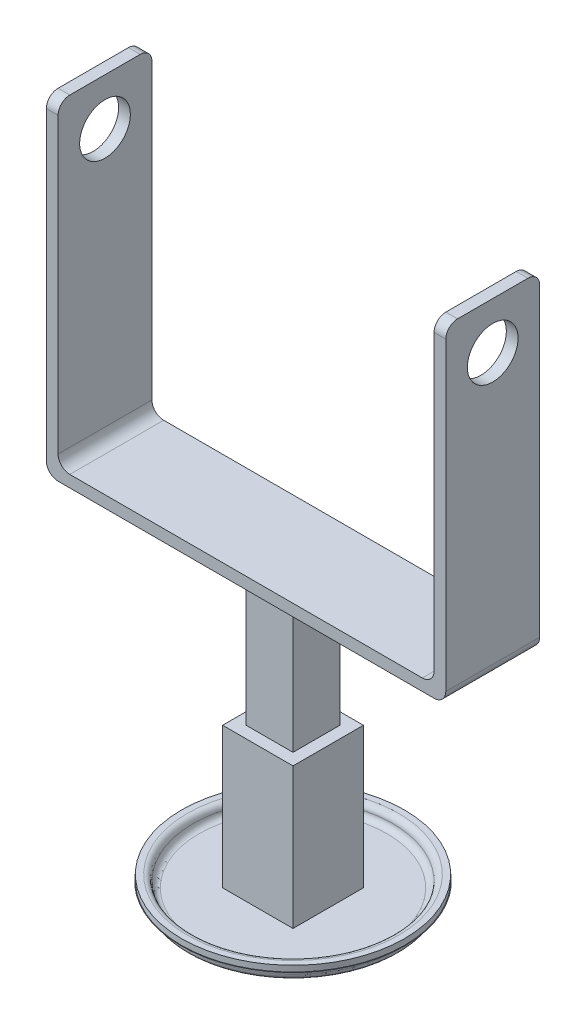
ISO-10303-21;
HEADER;
FILE_DESCRIPTION(('STEP AP214'),'2;1');
FILE_NAME('part.step','',(''),(''),'','','');
FILE_SCHEMA(('AUTOMOTIVE_DESIGN { 1 0 10303 214 1 1 1 1 }'));
ENDSEC;
DATA;
#1=APPLICATION_CONTEXT('core data for automotive mechanical design processes');
#2=APPLICATION_PROTOCOL_DEFINITION('international standard','automotive_design',2000,#1);
#3=PRODUCT_CONTEXT('',#1,'mechanical');
#4=PRODUCT('Part','Part','',(#3));
#5=PRODUCT_RELATED_PRODUCT_CATEGORY('part','',(#4));
#6=PRODUCT_DEFINITION_FORMATION('','',#4);
#7=PRODUCT_DEFINITION_CONTEXT('part definition',#1,'design');
#8=PRODUCT_DEFINITION('design','',#6,#7);
#9=PRODUCT_DEFINITION_SHAPE('','',#8);
#10=(LENGTH_UNIT() NAMED_UNIT(*) SI_UNIT(.MILLI.,.METRE.));
#11=(NAMED_UNIT(*) PLANE_ANGLE_UNIT() SI_UNIT($,.RADIAN.));
#12=(NAMED_UNIT(*) SI_UNIT($,.STERADIAN.) SOLID_ANGLE_UNIT());
#13=UNCERTAINTY_MEASURE_WITH_UNIT(LENGTH_MEASURE(1.E-05),#10,'distance_accuracy_value','');
#14=(GEOMETRIC_REPRESENTATION_CONTEXT(3) GLOBAL_UNCERTAINTY_ASSIGNED_CONTEXT((#13)) GLOBAL_UNIT_ASSIGNED_CONTEXT((#10,
#11,#12)) REPRESENTATION_CONTEXT('',''));
#15=CARTESIAN_POINT('',(0.,0.,0.));
#16=DIRECTION('',(0.,0.,1.));
#17=DIRECTION('',(1.,0.,0.));
#18=AXIS2_PLACEMENT_3D('',#15,#16,#17);
#19=CARTESIAN_POINT('',(0.,79.375,0.));
#20=DIRECTION('',(0.,-1.,0.));
#21=DIRECTION('',(1.,0.,0.));
#22=AXIS2_PLACEMENT_3D('',#19,#20,#21);
#23=PLANE('',#22);
#24=DIRECTION('',(0.,0.,1.));
#25=VECTOR('',#24,1.);
#26=CARTESIAN_POINT('',(-19.0499999999999,79.3750000000001,-19.05));
#27=LINE('',#26,#25);
#28=CARTESIAN_POINT('',(-19.0499999999999,79.3750000000001,-19.05));
#29=VERTEX_POINT('',#28);
#30=CARTESIAN_POINT('',(-19.0499999999999,79.3750000000001,19.05));
#31=VERTEX_POINT('',#30);
#32=EDGE_CURVE('E241',#29,#31,#27,.T.);
#33=ORIENTED_EDGE('',*,*,#32,.T.);
#34=DIRECTION('',(1.,0.,0.));
#35=VECTOR('',#34,1.);
#36=CARTESIAN_POINT('',(19.0500000000001,79.375,19.05));
#37=LINE('',#36,#35);
#38=CARTESIAN_POINT('',(19.0500000000001,79.375,19.05));
#39=VERTEX_POINT('',#38);
#40=EDGE_CURVE('E244',#31,#39,#37,.T.);
#41=ORIENTED_EDGE('',*,*,#40,.T.);
#42=DIRECTION('',(0.,0.,-1.));
#43=VECTOR('',#42,1.);
#44=CARTESIAN_POINT('',(19.0500000000001,79.375,-19.05));
#45=LINE('',#44,#43);
#46=CARTESIAN_POINT('',(19.0500000000001,79.375,-19.05));
#47=VERTEX_POINT('',#46);
#48=EDGE_CURVE('E247',#39,#47,#45,.T.);
#49=ORIENTED_EDGE('',*,*,#48,.T.);
#50=DIRECTION('',(-1.,0.,0.));
#51=VECTOR('',#50,1.);
#52=CARTESIAN_POINT('',(19.0500000000001,79.375,-19.05));
#53=LINE('',#52,#51);
#54=EDGE_CURVE('E249',#47,#29,#53,.T.);
#55=ORIENTED_EDGE('',*,*,#54,.T.);
#56=EDGE_LOOP('',(#33,#41,#49,#55));
#57=FACE_BOUND('',#56,.T.);
#58=DIRECTION('',(0.,0.,1.));
#59=VECTOR('',#58,1.);
#60=CARTESIAN_POINT('',(-12.6999999999999,79.375,-12.7));
#61=LINE('',#60,#59);
#62=CARTESIAN_POINT('',(-12.6999999999999,79.375,-12.7));
#63=VERTEX_POINT('',#62);
#64=CARTESIAN_POINT('',(-12.6999999999999,79.375,12.7));
#65=VERTEX_POINT('',#64);
#66=EDGE_CURVE('E225',#63,#65,#61,.T.);
#67=ORIENTED_EDGE('',*,*,#66,.F.);
#68=DIRECTION('',(-1.,0.,0.));
#69=VECTOR('',#68,1.);
#70=CARTESIAN_POINT('',(12.7000000000001,79.375,-12.7));
#71=LINE('',#70,#69);
#72=CARTESIAN_POINT('',(12.7000000000001,79.375,-12.7));
#73=VERTEX_POINT('',#72);
#74=EDGE_CURVE('E207',#73,#63,#71,.T.);
#75=ORIENTED_EDGE('',*,*,#74,.F.);
#76=DIRECTION('',(0.,0.,-1.));
#77=VECTOR('',#76,1.);
#78=CARTESIAN_POINT('',(12.7000000000001,79.375,-12.7));
#79=LINE('',#78,#77);
#80=CARTESIAN_POINT('',(12.7000000000001,79.375,12.7));
#81=VERTEX_POINT('',#80);
#82=EDGE_CURVE('E231',#81,#73,#79,.T.);
#83=ORIENTED_EDGE('',*,*,#82,.F.);
#84=DIRECTION('',(1.,0.,0.));
#85=VECTOR('',#84,1.);
#86=CARTESIAN_POINT('',(12.7000000000001,79.375,12.7));
#87=LINE('',#86,#85);
#88=EDGE_CURVE('E227',#65,#81,#87,.T.);
#89=ORIENTED_EDGE('',*,*,#88,.F.);
#90=EDGE_LOOP('',(#67,#75,#83,#89));
#91=FACE_BOUND('',#90,.T.);
#92=ADVANCED_FACE('F33',(#57,#91),#23,.F.);
#93=CARTESIAN_POINT('',(50.8,3.17499999999998,0.));
#94=DIRECTION('',(0.,-1.,0.));
#95=DIRECTION('',(1.,0.,0.));
#96=AXIS2_PLACEMENT_3D('',#93,#94,#95);
#97=PLANE('',#96);
#98=CARTESIAN_POINT('',(0.,3.17500000000006,0.));
#99=DIRECTION('',(0.,1.,0.));
#100=DIRECTION('',(-1.,0.,0.));
#101=AXIS2_PLACEMENT_3D('',#98,#99,#100);
#102=CIRCLE('',#101,50.8);
#103=CARTESIAN_POINT('',(-50.8,3.17500000000012,0.));
#104=VERTEX_POINT('',#103);
#105=EDGE_CURVE('E273',#104,#104,#102,.T.);
#106=ORIENTED_EDGE('',*,*,#105,.T.);
#107=EDGE_LOOP('',(#106));
#108=FACE_BOUND('',#107,.T.);
#109=DIRECTION('',(0.,0.,1.));
#110=VECTOR('',#109,1.);
#111=CARTESIAN_POINT('',(-19.05,3.17500000000005,-19.05));
#112=LINE('',#111,#110);
#113=CARTESIAN_POINT('',(-19.05,3.17500000000005,-19.05));
#114=VERTEX_POINT('',#113);
#115=CARTESIAN_POINT('',(-19.05,3.17500000000005,19.05));
#116=VERTEX_POINT('',#115);
#117=EDGE_CURVE('E240',#114,#116,#112,.T.);
#118=ORIENTED_EDGE('',*,*,#117,.F.);
#119=DIRECTION('',(-1.,0.,0.));
#120=VECTOR('',#119,1.);
#121=CARTESIAN_POINT('',(19.05,3.17500000000001,-19.05));
#122=LINE('',#121,#120);
#123=CARTESIAN_POINT('',(19.0500000000001,3.17500000000001,-19.05));
#124=VERTEX_POINT('',#123);
#125=EDGE_CURVE('E245',#124,#114,#122,.T.);
#126=ORIENTED_EDGE('',*,*,#125,.F.);
#127=DIRECTION('',(0.,0.,-1.));
#128=VECTOR('',#127,1.);
#129=CARTESIAN_POINT('',(19.05,3.17500000000001,-19.05));
#130=LINE('',#129,#128);
#131=CARTESIAN_POINT('',(19.05,3.17500000000001,19.05));
#132=VERTEX_POINT('',#131);
#133=EDGE_CURVE('E257',#132,#124,#130,.T.);
#134=ORIENTED_EDGE('',*,*,#133,.F.);
#135=DIRECTION('',(1.,0.,0.));
#136=VECTOR('',#135,1.);
#137=CARTESIAN_POINT('',(19.05,3.17500000000001,19.05));
#138=LINE('',#137,#136);
#139=EDGE_CURVE('E254',#116,#132,#138,.T.);
#140=ORIENTED_EDGE('',*,*,#139,.F.);
#141=EDGE_LOOP('',(#118,#126,#134,#140));
#142=FACE_BOUND('',#141,.T.);
#143=ADVANCED_FACE('F393',(#108,#142),#97,.F.);
#144=CARTESIAN_POINT('',(0.,0.,0.));
#145=DIRECTION('',(0.,1.,0.));
#146=DIRECTION('',(-1.,0.,0.));
#147=AXIS2_PLACEMENT_3D('',#144,#145,#146);
#148=PLANE('',#147);
#149=CARTESIAN_POINT('',(0.,0.,0.));
#150=DIRECTION('',(0.,1.,0.));
#151=DIRECTION('',(-1.,0.,0.));
#152=AXIS2_PLACEMENT_3D('',#149,#150,#151);
#153=CIRCLE('',#152,54.2616930789836);
#154=CARTESIAN_POINT('',(-54.2616930789836,1.19654227792144E-13,0.));
#155=VERTEX_POINT('',#154);
#156=EDGE_CURVE('E294',#155,#155,#153,.T.);
#157=ORIENTED_EDGE('',*,*,#156,.F.);
#158=EDGE_LOOP('',(#157));
#159=FACE_BOUND('',#158,.T.);
#160=ADVANCED_FACE('F399',(#159),#148,.F.);
#161=CARTESIAN_POINT('',(0.,3.17500000000006,0.));
#162=DIRECTION('',(0.,1.,0.));
#163=DIRECTION('',(-1.,0.,0.));
#164=AXIS2_PLACEMENT_3D('',#161,#162,#163);
#165=TOROIDAL_SURFACE('',#164,54.2616930789836,3.175);
#166=CARTESIAN_POINT('',(0.,3.17500000000006,0.));
#167=DIRECTION('',(0.,1.,0.));
#168=DIRECTION('',(-1.,0.,0.));
#169=AXIS2_PLACEMENT_3D('',#166,#167,#168);
#170=CIRCLE('',#169,57.4366930789836);
#171=CARTESIAN_POINT('',(-57.4366930789836,3.17500000000013,0.));
#172=VERTEX_POINT('',#171);
#173=EDGE_CURVE('E291',#172,#172,#170,.T.);
#174=ORIENTED_EDGE('',*,*,#173,.F.);
#175=EDGE_LOOP('',(#174));
#176=FACE_BOUND('',#175,.T.);
#177=ORIENTED_EDGE('',*,*,#156,.T.);
#178=EDGE_LOOP('',(#177));
#179=FACE_BOUND('',#178,.T.);
#180=ADVANCED_FACE('F444',(#176,#179),#165,.T.);
#181=CARTESIAN_POINT('',(0.,3.17500000000007,0.));
#182=DIRECTION('',(0.,1.,0.));
#183=DIRECTION('',(-1.,0.,0.));
#184=AXIS2_PLACEMENT_3D('',#181,#182,#183);
#185=TOROIDAL_SURFACE('',#184,60.6116930789836,3.175);
#186=CARTESIAN_POINT('',(0.,6.35000000000007,0.));
#187=DIRECTION('',(0.,1.,0.));
#188=DIRECTION('',(-1.,0.,0.));
#189=AXIS2_PLACEMENT_3D('',#186,#187,#188);
#190=CIRCLE('',#189,60.6116930789836);
#191=CARTESIAN_POINT('',(-60.6116930789836,6.35000000000014,0.));
#192=VERTEX_POINT('',#191);
#193=EDGE_CURVE('E288',#192,#192,#190,.T.);
#194=ORIENTED_EDGE('',*,*,#193,.F.);
#195=EDGE_LOOP('',(#194));
#196=FACE_BOUND('',#195,.T.);
#197=ORIENTED_EDGE('',*,*,#173,.T.);
#198=EDGE_LOOP('',(#197));
#199=FACE_BOUND('',#198,.T.);
#200=ADVANCED_FACE('F440',(#196,#199),#185,.F.);
#201=CARTESIAN_POINT('',(60.6116930789836,6.35,0.));
#202=DIRECTION('',(0.,-1.,0.));
#203=DIRECTION('',(1.,0.,0.));
#204=AXIS2_PLACEMENT_3D('',#201,#202,#203);
#205=PLANE('',#204);
#206=CARTESIAN_POINT('',(0.,6.35000000000007,0.));
#207=DIRECTION('',(0.,1.,0.));
#208=DIRECTION('',(-1.,0.,0.));
#209=AXIS2_PLACEMENT_3D('',#206,#207,#208);
#210=CIRCLE('',#209,60.325);
#211=CARTESIAN_POINT('',(-60.325,6.35000000000014,0.));
#212=VERTEX_POINT('',#211);
#213=EDGE_CURVE('E285',#212,#212,#210,.T.);
#214=ORIENTED_EDGE('',*,*,#213,.F.);
#215=EDGE_LOOP('',(#214));
#216=FACE_BOUND('',#215,.T.);
#217=ORIENTED_EDGE('',*,*,#193,.T.);
#218=EDGE_LOOP('',(#217));
#219=FACE_BOUND('',#218,.T.);
#220=ADVANCED_FACE('F436',(#216,#219),#205,.F.);
#221=CARTESIAN_POINT('',(0.,3.175,0.));
#222=DIRECTION('',(0.,1.,0.));
#223=DIRECTION('',(-1.,0.,0.));
#224=AXIS2_PLACEMENT_3D('',#221,#222,#223);
#225=CYLINDRICAL_SURFACE('',#224,60.325);
#226=CARTESIAN_POINT('',(0.,9.52500000000007,0.));
#227=DIRECTION('',(0.,1.,0.));
#228=DIRECTION('',(-1.,0.,0.));
#229=AXIS2_PLACEMENT_3D('',#226,#227,#228);
#230=CIRCLE('',#229,60.325);
#231=CARTESIAN_POINT('',(-60.325,9.52500000000014,0.));
#232=VERTEX_POINT('',#231);
#233=EDGE_CURVE('E282',#232,#232,#230,.T.);
#234=ORIENTED_EDGE('',*,*,#233,.F.);
#235=EDGE_LOOP('',(#234));
#236=FACE_BOUND('',#235,.T.);
#237=ORIENTED_EDGE('',*,*,#213,.T.);
#238=EDGE_LOOP('',(#237));
#239=FACE_BOUND('',#238,.T.);
#240=ADVANCED_FACE('F432',(#236,#239),#225,.T.);
#241=CARTESIAN_POINT('',(60.325,9.525,0.));
#242=DIRECTION('',(0.,-1.,0.));
#243=DIRECTION('',(1.,0.,0.));
#244=AXIS2_PLACEMENT_3D('',#241,#242,#243);
#245=PLANE('',#244);
#246=CARTESIAN_POINT('',(0.,9.52500000000007,0.));
#247=DIRECTION('',(0.,1.,0.));
#248=DIRECTION('',(-1.,0.,0.));
#249=AXIS2_PLACEMENT_3D('',#246,#247,#248);
#250=CIRCLE('',#249,57.15);
#251=CARTESIAN_POINT('',(-57.15,9.52500000000013,0.));
#252=VERTEX_POINT('',#251);
#253=EDGE_CURVE('E279',#252,#252,#250,.T.);
#254=ORIENTED_EDGE('',*,*,#253,.F.);
#255=EDGE_LOOP('',(#254));
#256=FACE_BOUND('',#255,.T.);
#257=ORIENTED_EDGE('',*,*,#233,.T.);
#258=EDGE_LOOP('',(#257));
#259=FACE_BOUND('',#258,.T.);
#260=ADVANCED_FACE('F428',(#256,#259),#245,.F.);
#261=CARTESIAN_POINT('',(0.,6.35000000000007,0.));
#262=DIRECTION('',(0.,1.,0.));
#263=DIRECTION('',(-1.,0.,0.));
#264=AXIS2_PLACEMENT_3D('',#261,#262,#263);
#265=TOROIDAL_SURFACE('',#264,57.15,3.175);
#266=CARTESIAN_POINT('',(0.,6.35000000000006,0.));
#267=DIRECTION('',(0.,1.,0.));
#268=DIRECTION('',(-1.,0.,0.));
#269=AXIS2_PLACEMENT_3D('',#266,#267,#268);
#270=CIRCLE('',#269,53.975);
#271=CARTESIAN_POINT('',(-53.975,6.35000000000012,0.));
#272=VERTEX_POINT('',#271);
#273=EDGE_CURVE('E276',#272,#272,#270,.T.);
#274=ORIENTED_EDGE('',*,*,#273,.F.);
#275=EDGE_LOOP('',(#274));
#276=FACE_BOUND('',#275,.T.);
#277=ORIENTED_EDGE('',*,*,#253,.T.);
#278=EDGE_LOOP('',(#277));
#279=FACE_BOUND('',#278,.T.);
#280=ADVANCED_FACE('F424',(#276,#279),#265,.T.);
#281=CARTESIAN_POINT('',(0.,6.35000000000006,0.));
#282=DIRECTION('',(0.,1.,0.));
#283=DIRECTION('',(-1.,0.,0.));
#284=AXIS2_PLACEMENT_3D('',#281,#282,#283);
#285=TOROIDAL_SURFACE('',#284,50.8,3.175);
#286=ORIENTED_EDGE('',*,*,#105,.F.);
#287=EDGE_LOOP('',(#286));
#288=FACE_BOUND('',#287,.T.);
#289=ORIENTED_EDGE('',*,*,#273,.T.);
#290=EDGE_LOOP('',(#289));
#291=FACE_BOUND('',#290,.T.);
#292=ADVANCED_FACE('F419',(#288,#291),#285,.F.);
#293=CARTESIAN_POINT('',(-19.0499999999999,79.3750000000001,-19.05));
#294=DIRECTION('',(1.,0.,0.));
#295=DIRECTION('',(0.,1.,0.));
#296=AXIS2_PLACEMENT_3D('',#293,#294,#295);
#297=PLANE('',#296);
#298=ORIENTED_EDGE('',*,*,#117,.T.);
#299=DIRECTION('',(0.,-1.,0.));
#300=VECTOR('',#299,1.);
#301=CARTESIAN_POINT('',(-19.0499999999999,79.3750000000001,19.05));
#302=LINE('',#301,#300);
#303=EDGE_CURVE('E270',#31,#116,#302,.T.);
#304=ORIENTED_EDGE('',*,*,#303,.F.);
#305=ORIENTED_EDGE('',*,*,#32,.F.);
#306=DIRECTION('',(0.,-1.,0.));
#307=VECTOR('',#306,1.);
#308=CARTESIAN_POINT('',(-19.0499999999999,79.3750000000001,-19.05));
#309=LINE('',#308,#307);
#310=EDGE_CURVE('E251',#29,#114,#309,.T.);
#311=ORIENTED_EDGE('',*,*,#310,.T.);
#312=EDGE_LOOP('',(#298,#304,#305,#311));
#313=FACE_BOUND('',#312,.T.);
#314=ADVANCED_FACE('F416',(#313),#297,.F.);
#315=CARTESIAN_POINT('',(19.0500000000001,79.375,19.05));
#316=DIRECTION('',(0.,0.,-1.));
#317=DIRECTION('',(-1.,0.,0.));
#318=AXIS2_PLACEMENT_3D('',#315,#316,#317);
#319=PLANE('',#318);
#320=ORIENTED_EDGE('',*,*,#139,.T.);
#321=DIRECTION('',(0.,-1.,0.));
#322=VECTOR('',#321,1.);
#323=CARTESIAN_POINT('',(19.0500000000001,79.375,19.05));
#324=LINE('',#323,#322);
#325=EDGE_CURVE('E267',#39,#132,#324,.T.);
#326=ORIENTED_EDGE('',*,*,#325,.F.);
#327=ORIENTED_EDGE('',*,*,#40,.F.);
#328=ORIENTED_EDGE('',*,*,#303,.T.);
#329=EDGE_LOOP('',(#320,#326,#327,#328));
#330=FACE_BOUND('',#329,.T.);
#331=ADVANCED_FACE('F412',(#330),#319,.F.);
#332=CARTESIAN_POINT('',(19.0500000000001,79.375,-19.05));
#333=DIRECTION('',(-1.,0.,0.));
#334=DIRECTION('',(0.,-1.,0.));
#335=AXIS2_PLACEMENT_3D('',#332,#333,#334);
#336=PLANE('',#335);
#337=ORIENTED_EDGE('',*,*,#133,.T.);
#338=DIRECTION('',(0.,-1.,0.));
#339=VECTOR('',#338,1.);
#340=CARTESIAN_POINT('',(19.0500000000001,79.375,-19.05));
#341=LINE('',#340,#339);
#342=EDGE_CURVE('E264',#47,#124,#341,.T.);
#343=ORIENTED_EDGE('',*,*,#342,.F.);
#344=ORIENTED_EDGE('',*,*,#48,.F.);
#345=ORIENTED_EDGE('',*,*,#325,.T.);
#346=EDGE_LOOP('',(#337,#343,#344,#345));
#347=FACE_BOUND('',#346,.T.);
#348=ADVANCED_FACE('F408',(#347),#336,.F.);
#349=CARTESIAN_POINT('',(19.0500000000001,79.375,-19.05));
#350=DIRECTION('',(0.,0.,1.));
#351=DIRECTION('',(1.,0.,0.));
#352=AXIS2_PLACEMENT_3D('',#349,#350,#351);
#353=PLANE('',#352);
#354=ORIENTED_EDGE('',*,*,#125,.T.);
#355=ORIENTED_EDGE('',*,*,#310,.F.);
#356=ORIENTED_EDGE('',*,*,#54,.F.);
#357=ORIENTED_EDGE('',*,*,#342,.T.);
#358=EDGE_LOOP('',(#354,#355,#356,#357));
#359=FACE_BOUND('',#358,.T.);
#360=ADVANCED_FACE('F405',(#359),#353,.F.);
#361=CARTESIAN_POINT('',(-12.6999999999998,155.575,-12.7));
#362=DIRECTION('',(1.,0.,0.));
#363=DIRECTION('',(0.,1.,0.));
#364=AXIS2_PLACEMENT_3D('',#361,#362,#363);
#365=PLANE('',#364);
#366=ORIENTED_EDGE('',*,*,#66,.T.);
#367=DIRECTION('',(0.,-1.,0.));
#368=VECTOR('',#367,1.);
#369=CARTESIAN_POINT('',(-12.6999999999998,155.575,12.7));
#370=LINE('',#369,#368);
#371=CARTESIAN_POINT('',(-12.6999999999998,155.575,12.7));
#372=VERTEX_POINT('',#371);
#373=EDGE_CURVE('E202',#372,#65,#370,.T.);
#374=ORIENTED_EDGE('',*,*,#373,.F.);
#375=DIRECTION('',(0.,0.,1.));
#376=VECTOR('',#375,1.);
#377=CARTESIAN_POINT('',(-12.6999999999998,155.575,-12.7));
#378=LINE('',#377,#376);
#379=CARTESIAN_POINT('',(-12.6999999999998,155.575,-12.7));
#380=VERTEX_POINT('',#379);
#381=EDGE_CURVE('E196',#380,#372,#378,.T.);
#382=ORIENTED_EDGE('',*,*,#381,.F.);
#383=DIRECTION('',(0.,-1.,0.));
#384=VECTOR('',#383,1.);
#385=CARTESIAN_POINT('',(-12.6999999999998,155.575,-12.7));
#386=LINE('',#385,#384);
#387=EDGE_CURVE('E200',#380,#63,#386,.T.);
#388=ORIENTED_EDGE('',*,*,#387,.T.);
#389=EDGE_LOOP('',(#366,#374,#382,#388));
#390=FACE_BOUND('',#389,.T.);
#391=ADVANCED_FACE('F199',(#390),#365,.F.);
#392=CARTESIAN_POINT('',(12.7000000000002,155.575,12.7));
#393=DIRECTION('',(0.,0.,-1.));
#394=DIRECTION('',(-1.,0.,0.));
#395=AXIS2_PLACEMENT_3D('',#392,#393,#394);
#396=PLANE('',#395);
#397=ORIENTED_EDGE('',*,*,#88,.T.);
#398=DIRECTION('',(0.,-1.,0.));
#399=VECTOR('',#398,1.);
#400=CARTESIAN_POINT('',(12.7000000000002,155.575,12.7));
#401=LINE('',#400,#399);
#402=CARTESIAN_POINT('',(12.7000000000002,155.575,12.7));
#403=VERTEX_POINT('',#402);
#404=EDGE_CURVE('E236',#403,#81,#401,.T.);
#405=ORIENTED_EDGE('',*,*,#404,.F.);
#406=DIRECTION('',(1.,0.,0.));
#407=VECTOR('',#406,1.);
#408=CARTESIAN_POINT('',(12.7000000000002,155.575,12.7));
#409=LINE('',#408,#407);
#410=EDGE_CURVE('E206',#372,#403,#409,.T.);
#411=ORIENTED_EDGE('',*,*,#410,.F.);
#412=ORIENTED_EDGE('',*,*,#373,.T.);
#413=EDGE_LOOP('',(#397,#405,#411,#412));
#414=FACE_BOUND('',#413,.T.);
#415=ADVANCED_FACE('F388',(#414),#396,.F.);
#416=CARTESIAN_POINT('',(12.7000000000002,155.575,-12.7));
#417=DIRECTION('',(-1.,0.,0.));
#418=DIRECTION('',(0.,-1.,0.));
#419=AXIS2_PLACEMENT_3D('',#416,#417,#418);
#420=PLANE('',#419);
#421=ORIENTED_EDGE('',*,*,#82,.T.);
#422=DIRECTION('',(0.,-1.,0.));
#423=VECTOR('',#422,1.);
#424=CARTESIAN_POINT('',(12.7000000000002,155.575,-12.7));
#425=LINE('',#424,#423);
#426=CARTESIAN_POINT('',(12.7000000000002,155.575,-12.7));
#427=VERTEX_POINT('',#426);
#428=EDGE_CURVE('E216',#427,#73,#425,.T.);
#429=ORIENTED_EDGE('',*,*,#428,.F.);
#430=DIRECTION('',(0.,0.,-1.));
#431=VECTOR('',#430,1.);
#432=CARTESIAN_POINT('',(12.7000000000002,155.575,-12.7));
#433=LINE('',#432,#431);
#434=EDGE_CURVE('E220',#403,#427,#433,.T.);
#435=ORIENTED_EDGE('',*,*,#434,.F.);
#436=ORIENTED_EDGE('',*,*,#404,.T.);
#437=EDGE_LOOP('',(#421,#429,#435,#436));
#438=FACE_BOUND('',#437,.T.);
#439=ADVANCED_FACE('F390',(#438),#420,.F.);
#440=CARTESIAN_POINT('',(12.7000000000002,155.575,-12.7));
#441=DIRECTION('',(0.,0.,1.));
#442=DIRECTION('',(1.,0.,0.));
#443=AXIS2_PLACEMENT_3D('',#440,#441,#442);
#444=PLANE('',#443);
#445=ORIENTED_EDGE('',*,*,#74,.T.);
#446=ORIENTED_EDGE('',*,*,#387,.F.);
#447=DIRECTION('',(-1.,0.,0.));
#448=VECTOR('',#447,1.);
#449=CARTESIAN_POINT('',(12.7000000000002,155.575,-12.7));
#450=LINE('',#449,#448);
#451=EDGE_CURVE('E214',#427,#380,#450,.T.);
#452=ORIENTED_EDGE('',*,*,#451,.F.);
#453=ORIENTED_EDGE('',*,*,#428,.T.);
#454=EDGE_LOOP('',(#445,#446,#452,#453));
#455=FACE_BOUND('',#454,.T.);
#456=ADVANCED_FACE('F212',(#455),#444,.F.);
#457=CARTESIAN_POINT('',(108.077,155.575,25.4));
#458=DIRECTION('',(0.,1.,0.));
#459=DIRECTION('',(-1.,0.,0.));
#460=AXIS2_PLACEMENT_3D('',#457,#458,#459);
#461=PLANE('',#460);
#462=DIRECTION('',(1.,0.,0.));
#463=VECTOR('',#462,1.);
#464=CARTESIAN_POINT('',(108.077,155.575,25.4));
#465=LINE('',#464,#463);
#466=CARTESIAN_POINT('',(-101.727,155.575,25.4));
#467=VERTEX_POINT('',#466);
#468=CARTESIAN_POINT('',(101.727,155.575,25.4));
#469=VERTEX_POINT('',#468);
#470=EDGE_CURVE('E496',#467,#469,#465,.T.);
#471=ORIENTED_EDGE('',*,*,#470,.F.);
#472=DIRECTION('',(0.,0.,-1.));
#473=VECTOR('',#472,1.);
#474=CARTESIAN_POINT('',(-101.727,155.575,25.4));
#475=LINE('',#474,#473);
#476=CARTESIAN_POINT('',(-101.727,155.575,-25.4));
#477=VERTEX_POINT('',#476);
#478=EDGE_CURVE('E319',#467,#477,#475,.T.);
#479=ORIENTED_EDGE('',*,*,#478,.T.);
#480=DIRECTION('',(1.,0.,0.));
#481=VECTOR('',#480,1.);
#482=CARTESIAN_POINT('',(108.077,155.575,-25.4));
#483=LINE('',#482,#481);
#484=CARTESIAN_POINT('',(101.727,155.575,-25.4));
#485=VERTEX_POINT('',#484);
#486=EDGE_CURVE('E509',#477,#485,#483,.T.);
#487=ORIENTED_EDGE('',*,*,#486,.T.);
#488=DIRECTION('',(0.,0.,-1.));
#489=VECTOR('',#488,1.);
#490=CARTESIAN_POINT('',(101.727,155.575,25.4));
#491=LINE('',#490,#489);
#492=EDGE_CURVE('E317',#485,#469,#491,.F.);
#493=ORIENTED_EDGE('',*,*,#492,.T.);
#494=EDGE_LOOP('',(#471,#479,#487,#493));
#495=FACE_BOUND('',#494,.T.);
#496=ORIENTED_EDGE('',*,*,#451,.T.);
#497=ORIENTED_EDGE('',*,*,#381,.T.);
#498=ORIENTED_EDGE('',*,*,#410,.T.);
#499=ORIENTED_EDGE('',*,*,#434,.T.);
#500=EDGE_LOOP('',(#496,#497,#498,#499));
#501=FACE_BOUND('',#500,.T.);
#502=ADVANCED_FACE('F218',(#495,#501),#461,.F.);
#503=CARTESIAN_POINT('',(-108.077,333.375,25.4));
#504=DIRECTION('',(0.,-1.,0.));
#505=DIRECTION('',(0.,0.,-1.));
#506=AXIS2_PLACEMENT_3D('',#503,#504,#505);
#507=PLANE('',#506);
#508=DIRECTION('',(0.,0.,-1.));
#509=VECTOR('',#508,1.);
#510=CARTESIAN_POINT('',(-101.727,333.375,25.4));
#511=LINE('',#510,#509);
#512=CARTESIAN_POINT('',(-101.727,333.375,19.05));
#513=VERTEX_POINT('',#512);
#514=CARTESIAN_POINT('',(-101.727,333.375,-19.05));
#515=VERTEX_POINT('',#514);
#516=EDGE_CURVE('E378',#513,#515,#511,.T.);
#517=ORIENTED_EDGE('',*,*,#516,.T.);
#518=DIRECTION('',(-1.,0.,0.));
#519=VECTOR('',#518,1.);
#520=CARTESIAN_POINT('',(-108.077,333.375,-19.05));
#521=LINE('',#520,#519);
#522=CARTESIAN_POINT('',(-108.077,333.375,-19.05));
#523=VERTEX_POINT('',#522);
#524=EDGE_CURVE('E339',#515,#523,#521,.T.);
#525=ORIENTED_EDGE('',*,*,#524,.T.);
#526=DIRECTION('',(0.,0.,-1.));
#527=VECTOR('',#526,1.);
#528=CARTESIAN_POINT('',(-108.077,333.375,25.4));
#529=LINE('',#528,#527);
#530=CARTESIAN_POINT('',(-108.077,333.375,19.05));
#531=VERTEX_POINT('',#530);
#532=EDGE_CURVE('E228',#531,#523,#529,.T.);
#533=ORIENTED_EDGE('',*,*,#532,.F.);
#534=DIRECTION('',(-1.,0.,0.));
#535=VECTOR('',#534,1.);
#536=CARTESIAN_POINT('',(-108.077,333.375,19.05));
#537=LINE('',#536,#535);
#538=EDGE_CURVE('E337',#531,#513,#537,.F.);
#539=ORIENTED_EDGE('',*,*,#538,.T.);
#540=EDGE_LOOP('',(#517,#525,#533,#539));
#541=FACE_BOUND('',#540,.T.);
#542=ADVANCED_FACE('F571',(#541),#507,.F.);
#543=CARTESIAN_POINT('',(-108.077,155.575,25.4));
#544=DIRECTION('',(1.,0.,0.));
#545=DIRECTION('',(0.,0.,-1.));
#546=AXIS2_PLACEMENT_3D('',#543,#544,#545);
#547=PLANE('',#546);
#548=CARTESIAN_POINT('',(-108.077,307.975,0.));
#549=DIRECTION('',(1.,0.,0.));
#550=DIRECTION('',(0.,0.,-1.));
#551=AXIS2_PLACEMENT_3D('',#548,#549,#550);
#552=CIRCLE('',#551,13.716);
#553=CARTESIAN_POINT('',(-108.077,307.975,-13.716));
#554=VERTEX_POINT('',#553);
#555=EDGE_CURVE('E531',#554,#554,#552,.T.);
#556=ORIENTED_EDGE('',*,*,#555,.T.);
#557=EDGE_LOOP('',(#556));
#558=FACE_BOUND('',#557,.T.);
#559=ORIENTED_EDGE('',*,*,#532,.T.);
#560=CARTESIAN_POINT('',(-108.077,327.025,-19.05));
#561=DIRECTION('',(1.,0.,0.));
#562=DIRECTION('',(0.,0.,-1.));
#563=AXIS2_PLACEMENT_3D('',#560,#561,#562);
#564=CIRCLE('',#563,6.35);
#565=CARTESIAN_POINT('',(-108.077,327.025,-25.4));
#566=VERTEX_POINT('',#565);
#567=EDGE_CURVE('E344',#523,#566,#564,.F.);
#568=ORIENTED_EDGE('',*,*,#567,.T.);
#569=DIRECTION('',(0.,-1.,0.));
#570=VECTOR('',#569,1.);
#571=CARTESIAN_POINT('',(-108.077,155.575,-25.4));
#572=LINE('',#571,#570);
#573=CARTESIAN_POINT('',(-108.077,161.925,-25.4));
#574=VERTEX_POINT('',#573);
#575=EDGE_CURVE('E507',#566,#574,#572,.T.);
#576=ORIENTED_EDGE('',*,*,#575,.T.);
#577=DIRECTION('',(0.,0.,-1.));
#578=VECTOR('',#577,1.);
#579=CARTESIAN_POINT('',(-108.077,161.925,25.4));
#580=LINE('',#579,#578);
#581=CARTESIAN_POINT('',(-108.077,161.925,25.4));
#582=VERTEX_POINT('',#581);
#583=EDGE_CURVE('E327',#574,#582,#580,.F.);
#584=ORIENTED_EDGE('',*,*,#583,.T.);
#585=DIRECTION('',(0.,-1.,0.));
#586=VECTOR('',#585,1.);
#587=CARTESIAN_POINT('',(-108.077,155.575,25.4));
#588=LINE('',#587,#586);
#589=CARTESIAN_POINT('',(-108.077,327.025,25.4));
#590=VERTEX_POINT('',#589);
#591=EDGE_CURVE('E500',#590,#582,#588,.T.);
#592=ORIENTED_EDGE('',*,*,#591,.F.);
#593=CARTESIAN_POINT('',(-108.077,327.025,19.05));
#594=DIRECTION('',(1.,0.,0.));
#595=DIRECTION('',(0.,0.,-1.));
#596=AXIS2_PLACEMENT_3D('',#593,#594,#595);
#597=CIRCLE('',#596,6.35);
#598=EDGE_CURVE('E342',#590,#531,#597,.F.);
#599=ORIENTED_EDGE('',*,*,#598,.T.);
#600=EDGE_LOOP('',(#559,#568,#576,#584,#592,#599));
#601=FACE_BOUND('',#600,.T.);
#602=ADVANCED_FACE('F567',(#558,#601),#547,.F.);
#603=CARTESIAN_POINT('',(108.077,155.575,25.4));
#604=DIRECTION('',(-1.,0.,0.));
#605=DIRECTION('',(0.,-1.,0.));
#606=AXIS2_PLACEMENT_3D('',#603,#604,#605);
#607=PLANE('',#606);
#608=CARTESIAN_POINT('',(108.077,307.975,0.));
#609=DIRECTION('',(1.,0.,0.));
#610=DIRECTION('',(0.,0.,-1.));
#611=AXIS2_PLACEMENT_3D('',#608,#609,#610);
#612=CIRCLE('',#611,13.716);
#613=CARTESIAN_POINT('',(108.077,307.975,-13.716));
#614=VERTEX_POINT('',#613);
#615=EDGE_CURVE('E528',#614,#614,#612,.T.);
#616=ORIENTED_EDGE('',*,*,#615,.F.);
#617=EDGE_LOOP('',(#616));
#618=FACE_BOUND('',#617,.T.);
#619=DIRECTION('',(0.,0.,-1.));
#620=VECTOR('',#619,1.);
#621=CARTESIAN_POINT('',(108.077,333.375,25.4));
#622=LINE('',#621,#620);
#623=CARTESIAN_POINT('',(108.077,333.375,19.05));
#624=VERTEX_POINT('',#623);
#625=CARTESIAN_POINT('',(108.077,333.375,-19.05));
#626=VERTEX_POINT('',#625);
#627=EDGE_CURVE('E372',#624,#626,#622,.T.);
#628=ORIENTED_EDGE('',*,*,#627,.F.);
#629=CARTESIAN_POINT('',(108.077,327.025,19.05));
#630=DIRECTION('',(-1.,0.,0.));
#631=DIRECTION('',(0.,-1.,0.));
#632=AXIS2_PLACEMENT_3D('',#629,#630,#631);
#633=CIRCLE('',#632,6.35);
#634=CARTESIAN_POINT('',(108.077,327.025,25.4));
#635=VERTEX_POINT('',#634);
#636=EDGE_CURVE('E11',#624,#635,#633,.F.);
#637=ORIENTED_EDGE('',*,*,#636,.T.);
#638=DIRECTION('',(0.,1.,0.));
#639=VECTOR('',#638,1.);
#640=CARTESIAN_POINT('',(108.077,155.575,25.4));
#641=LINE('',#640,#639);
#642=CARTESIAN_POINT('',(108.077,161.925,25.4));
#643=VERTEX_POINT('',#642);
#644=EDGE_CURVE('E488',#643,#635,#641,.T.);
#645=ORIENTED_EDGE('',*,*,#644,.F.);
#646=DIRECTION('',(0.,0.,-1.));
#647=VECTOR('',#646,1.);
#648=CARTESIAN_POINT('',(108.077,161.925,25.4));
#649=LINE('',#648,#647);
#650=CARTESIAN_POINT('',(108.077,161.925,-25.4));
#651=VERTEX_POINT('',#650);
#652=EDGE_CURVE('E334',#643,#651,#649,.T.);
#653=ORIENTED_EDGE('',*,*,#652,.T.);
#654=DIRECTION('',(0.,1.,0.));
#655=VECTOR('',#654,1.);
#656=CARTESIAN_POINT('',(108.077,155.575,-25.4));
#657=LINE('',#656,#655);
#658=CARTESIAN_POINT('',(108.077,327.025,-25.4));
#659=VERTEX_POINT('',#658);
#660=EDGE_CURVE('E513',#651,#659,#657,.T.);
#661=ORIENTED_EDGE('',*,*,#660,.T.);
#662=CARTESIAN_POINT('',(108.077,327.025,-19.05));
#663=DIRECTION('',(-1.,0.,0.));
#664=DIRECTION('',(0.,-1.,0.));
#665=AXIS2_PLACEMENT_3D('',#662,#663,#664);
#666=CIRCLE('',#665,6.35);
#667=EDGE_CURVE('E42',#659,#626,#666,.F.);
#668=ORIENTED_EDGE('',*,*,#667,.T.);
#669=EDGE_LOOP('',(#628,#637,#645,#653,#661,#668));
#670=FACE_BOUND('',#669,.T.);
#671=ADVANCED_FACE('F487',(#618,#670),#607,.F.);
#672=CARTESIAN_POINT('',(101.727,333.375,25.4));
#673=DIRECTION('',(0.,-1.,0.));
#674=DIRECTION('',(1.,0.,0.));
#675=AXIS2_PLACEMENT_3D('',#672,#673,#674);
#676=PLANE('',#675);
#677=DIRECTION('',(0.,0.,-1.));
#678=VECTOR('',#677,1.);
#679=CARTESIAN_POINT('',(101.727,333.375,25.4));
#680=LINE('',#679,#678);
#681=CARTESIAN_POINT('',(101.727,333.375,19.05));
#682=VERTEX_POINT('',#681);
#683=CARTESIAN_POINT('',(101.727,333.375,-19.05));
#684=VERTEX_POINT('',#683);
#685=EDGE_CURVE('E371',#682,#684,#680,.T.);
#686=ORIENTED_EDGE('',*,*,#685,.F.);
#687=DIRECTION('',(-1.,0.,0.));
#688=VECTOR('',#687,1.);
#689=CARTESIAN_POINT('',(101.727,333.375,19.05));
#690=LINE('',#689,#688);
#691=EDGE_CURVE('E55',#682,#624,#690,.F.);
#692=ORIENTED_EDGE('',*,*,#691,.T.);
#693=ORIENTED_EDGE('',*,*,#627,.T.);
#694=DIRECTION('',(-1.,0.,0.));
#695=VECTOR('',#694,1.);
#696=CARTESIAN_POINT('',(101.727,333.375,-19.05));
#697=LINE('',#696,#695);
#698=EDGE_CURVE('E364',#626,#684,#697,.T.);
#699=ORIENTED_EDGE('',*,*,#698,.T.);
#700=EDGE_LOOP('',(#686,#692,#693,#699));
#701=FACE_BOUND('',#700,.T.);
#702=ADVANCED_FACE('F370',(#701),#676,.F.);
#703=CARTESIAN_POINT('',(101.727,161.925,25.4));
#704=DIRECTION('',(1.,0.,0.));
#705=DIRECTION('',(0.,0.,-1.));
#706=AXIS2_PLACEMENT_3D('',#703,#704,#705);
#707=PLANE('',#706);
#708=CARTESIAN_POINT('',(101.727,307.975,0.));
#709=DIRECTION('',(1.,0.,0.));
#710=DIRECTION('',(0.,0.,-1.));
#711=AXIS2_PLACEMENT_3D('',#708,#709,#710);
#712=CIRCLE('',#711,13.716);
#713=CARTESIAN_POINT('',(101.727,307.975,-13.716));
#714=VERTEX_POINT('',#713);
#715=EDGE_CURVE('E510',#714,#714,#712,.T.);
#716=ORIENTED_EDGE('',*,*,#715,.T.);
#717=EDGE_LOOP('',(#716));
#718=FACE_BOUND('',#717,.T.);
#719=DIRECTION('',(0.,-1.,0.));
#720=VECTOR('',#719,1.);
#721=CARTESIAN_POINT('',(101.727,161.925,25.4));
#722=LINE('',#721,#720);
#723=CARTESIAN_POINT('',(101.727,327.025,25.4));
#724=VERTEX_POINT('',#723);
#725=CARTESIAN_POINT('',(101.727,168.275,25.4));
#726=VERTEX_POINT('',#725);
#727=EDGE_CURVE('E495',#724,#726,#722,.T.);
#728=ORIENTED_EDGE('',*,*,#727,.F.);
#729=CARTESIAN_POINT('',(101.727,327.025,19.05));
#730=DIRECTION('',(1.,0.,0.));
#731=DIRECTION('',(0.,0.,-1.));
#732=AXIS2_PLACEMENT_3D('',#729,#730,#731);
#733=CIRCLE('',#732,6.35);
#734=EDGE_CURVE('E362',#724,#682,#733,.F.);
#735=ORIENTED_EDGE('',*,*,#734,.T.);
#736=ORIENTED_EDGE('',*,*,#685,.T.);
#737=CARTESIAN_POINT('',(101.727,327.025,-19.05));
#738=DIRECTION('',(1.,0.,0.));
#739=DIRECTION('',(0.,0.,-1.));
#740=AXIS2_PLACEMENT_3D('',#737,#738,#739);
#741=CIRCLE('',#740,6.35);
#742=CARTESIAN_POINT('',(101.727,327.025,-25.4));
#743=VERTEX_POINT('',#742);
#744=EDGE_CURVE('E360',#684,#743,#741,.F.);
#745=ORIENTED_EDGE('',*,*,#744,.T.);
#746=DIRECTION('',(0.,-1.,0.));
#747=VECTOR('',#746,1.);
#748=CARTESIAN_POINT('',(101.727,161.925,-25.4));
#749=LINE('',#748,#747);
#750=CARTESIAN_POINT('',(101.727,168.275,-25.4));
#751=VERTEX_POINT('',#750);
#752=EDGE_CURVE('E515',#743,#751,#749,.T.);
#753=ORIENTED_EDGE('',*,*,#752,.T.);
#754=DIRECTION('',(0.,0.,-1.));
#755=VECTOR('',#754,1.);
#756=CARTESIAN_POINT('',(101.727,168.275,25.4));
#757=LINE('',#756,#755);
#758=EDGE_CURVE('E300',#751,#726,#757,.F.);
#759=ORIENTED_EDGE('',*,*,#758,.T.);
#760=EDGE_LOOP('',(#728,#735,#736,#745,#753,#759));
#761=FACE_BOUND('',#760,.T.);
#762=ADVANCED_FACE('F376',(#718,#761),#707,.F.);
#763=CARTESIAN_POINT('',(-101.727,161.925,25.4));
#764=DIRECTION('',(0.,-1.,0.));
#765=DIRECTION('',(0.,0.,-1.));
#766=AXIS2_PLACEMENT_3D('',#763,#764,#765);
#767=PLANE('',#766);
#768=DIRECTION('',(-1.,0.,0.));
#769=VECTOR('',#768,1.);
#770=CARTESIAN_POINT('',(-101.727,161.925,-25.4));
#771=LINE('',#770,#769);
#772=CARTESIAN_POINT('',(95.3769999999999,161.925,-25.4));
#773=VERTEX_POINT('',#772);
#774=CARTESIAN_POINT('',(-95.377,161.925,-25.4));
#775=VERTEX_POINT('',#774);
#776=EDGE_CURVE('E517',#773,#775,#771,.T.);
#777=ORIENTED_EDGE('',*,*,#776,.T.);
#778=DIRECTION('',(0.,0.,-1.));
#779=VECTOR('',#778,1.);
#780=CARTESIAN_POINT('',(-95.377,161.925,25.4));
#781=LINE('',#780,#779);
#782=CARTESIAN_POINT('',(-95.377,161.925,25.4));
#783=VERTEX_POINT('',#782);
#784=EDGE_CURVE('E311',#775,#783,#781,.F.);
#785=ORIENTED_EDGE('',*,*,#784,.T.);
#786=DIRECTION('',(-1.,0.,0.));
#787=VECTOR('',#786,1.);
#788=CARTESIAN_POINT('',(-101.727,161.925,25.4));
#789=LINE('',#788,#787);
#790=CARTESIAN_POINT('',(95.3769999999999,161.925,25.4));
#791=VERTEX_POINT('',#790);
#792=EDGE_CURVE('E498',#791,#783,#789,.T.);
#793=ORIENTED_EDGE('',*,*,#792,.F.);
#794=DIRECTION('',(0.,0.,-1.));
#795=VECTOR('',#794,1.);
#796=CARTESIAN_POINT('',(95.377,161.925,-25.4));
#797=LINE('',#796,#795);
#798=EDGE_CURVE('E297',#791,#773,#797,.T.);
#799=ORIENTED_EDGE('',*,*,#798,.T.);
#800=EDGE_LOOP('',(#777,#785,#793,#799));
#801=FACE_BOUND('',#800,.T.);
#802=ADVANCED_FACE('F556',(#801),#767,.F.);
#803=CARTESIAN_POINT('',(-101.727,333.375,25.4));
#804=DIRECTION('',(-1.,0.,0.));
#805=DIRECTION('',(0.,-1.,0.));
#806=AXIS2_PLACEMENT_3D('',#803,#804,#805);
#807=PLANE('',#806);
#808=CARTESIAN_POINT('',(-101.727,307.975,0.));
#809=DIRECTION('',(-1.,0.,0.));
#810=DIRECTION('',(0.,-1.,0.));
#811=AXIS2_PLACEMENT_3D('',#808,#809,#810);
#812=CIRCLE('',#811,13.716);
#813=CARTESIAN_POINT('',(-101.727,294.259,0.));
#814=VERTEX_POINT('',#813);
#815=EDGE_CURVE('E37',#814,#814,#812,.T.);
#816=ORIENTED_EDGE('',*,*,#815,.T.);
#817=EDGE_LOOP('',(#816));
#818=FACE_BOUND('',#817,.T.);
#819=DIRECTION('',(0.,1.,0.));
#820=VECTOR('',#819,1.);
#821=CARTESIAN_POINT('',(-101.727,333.375,-25.4));
#822=LINE('',#821,#820);
#823=CARTESIAN_POINT('',(-101.727,168.275,-25.4));
#824=VERTEX_POINT('',#823);
#825=CARTESIAN_POINT('',(-101.727,327.025,-25.4));
#826=VERTEX_POINT('',#825);
#827=EDGE_CURVE('E519',#824,#826,#822,.T.);
#828=ORIENTED_EDGE('',*,*,#827,.T.);
#829=CARTESIAN_POINT('',(-101.727,327.025,-19.05));
#830=DIRECTION('',(-1.,0.,0.));
#831=DIRECTION('',(0.,-1.,0.));
#832=AXIS2_PLACEMENT_3D('',#829,#830,#831);
#833=CIRCLE('',#832,6.35);
#834=EDGE_CURVE('E352',#826,#515,#833,.F.);
#835=ORIENTED_EDGE('',*,*,#834,.T.);
#836=ORIENTED_EDGE('',*,*,#516,.F.);
#837=CARTESIAN_POINT('',(-101.727,327.025,19.05));
#838=DIRECTION('',(-1.,0.,0.));
#839=DIRECTION('',(0.,-1.,0.));
#840=AXIS2_PLACEMENT_3D('',#837,#838,#839);
#841=CIRCLE('',#840,6.35);
#842=CARTESIAN_POINT('',(-101.727,327.025,25.4));
#843=VERTEX_POINT('',#842);
#844=EDGE_CURVE('E350',#513,#843,#841,.F.);
#845=ORIENTED_EDGE('',*,*,#844,.T.);
#846=DIRECTION('',(0.,1.,0.));
#847=VECTOR('',#846,1.);
#848=CARTESIAN_POINT('',(-101.727,333.375,25.4));
#849=LINE('',#848,#847);
#850=CARTESIAN_POINT('',(-101.727,168.275,25.4));
#851=VERTEX_POINT('',#850);
#852=EDGE_CURVE('E382',#851,#843,#849,.T.);
#853=ORIENTED_EDGE('',*,*,#852,.F.);
#854=DIRECTION('',(0.,0.,-1.));
#855=VECTOR('',#854,1.);
#856=CARTESIAN_POINT('',(-101.727,168.275,-25.4));
#857=LINE('',#856,#855);
#858=EDGE_CURVE('E308',#851,#824,#857,.T.);
#859=ORIENTED_EDGE('',*,*,#858,.T.);
#860=EDGE_LOOP('',(#828,#835,#836,#845,#853,#859));
#861=FACE_BOUND('',#860,.T.);
#862=ADVANCED_FACE('F538',(#818,#861),#807,.F.);
#863=CARTESIAN_POINT('',(0.,0.,25.4));
#864=DIRECTION('',(0.,0.,-1.));
#865=DIRECTION('',(-1.,0.,0.));
#866=AXIS2_PLACEMENT_3D('',#863,#864,#865);
#867=PLANE('',#866);
#868=ORIENTED_EDGE('',*,*,#852,.T.);
#869=DIRECTION('',(-1.,0.,0.));
#870=VECTOR('',#869,1.);
#871=CARTESIAN_POINT('',(0.,327.025,25.4));
#872=LINE('',#871,#870);
#873=EDGE_CURVE('E357',#843,#590,#872,.T.);
#874=ORIENTED_EDGE('',*,*,#873,.T.);
#875=ORIENTED_EDGE('',*,*,#591,.T.);
#876=CARTESIAN_POINT('',(-101.727,161.925,25.4));
#877=DIRECTION('',(0.,0.,-1.));
#878=DIRECTION('',(-1.,0.,0.));
#879=AXIS2_PLACEMENT_3D('',#876,#877,#878);
#880=CIRCLE('',#879,6.35);
#881=EDGE_CURVE('E332',#582,#467,#880,.F.);
#882=ORIENTED_EDGE('',*,*,#881,.T.);
#883=ORIENTED_EDGE('',*,*,#470,.T.);
#884=CARTESIAN_POINT('',(101.727,161.925,25.4));
#885=DIRECTION('',(0.,0.,-1.));
#886=DIRECTION('',(-1.,0.,0.));
#887=AXIS2_PLACEMENT_3D('',#884,#885,#886);
#888=CIRCLE('',#887,6.35);
#889=EDGE_CURVE('E330',#469,#643,#888,.F.);
#890=ORIENTED_EDGE('',*,*,#889,.T.);
#891=ORIENTED_EDGE('',*,*,#644,.T.);
#892=DIRECTION('',(-1.,0.,0.));
#893=VECTOR('',#892,1.);
#894=CARTESIAN_POINT('',(2.85882428840978E-12,327.025000000001,25.4));
#895=LINE('',#894,#893);
#896=EDGE_CURVE('E354',#635,#724,#895,.T.);
#897=ORIENTED_EDGE('',*,*,#896,.T.);
#898=ORIENTED_EDGE('',*,*,#727,.T.);
#899=CARTESIAN_POINT('',(95.377,168.275,25.4));
#900=DIRECTION('',(0.,0.,-1.));
#901=DIRECTION('',(-1.,0.,0.));
#902=AXIS2_PLACEMENT_3D('',#899,#900,#901);
#903=CIRCLE('',#902,6.35);
#904=EDGE_CURVE('E306',#726,#791,#903,.T.);
#905=ORIENTED_EDGE('',*,*,#904,.T.);
#906=ORIENTED_EDGE('',*,*,#792,.T.);
#907=CARTESIAN_POINT('',(-95.377,168.275,25.4));
#908=DIRECTION('',(0.,0.,-1.));
#909=DIRECTION('',(-1.,0.,0.));
#910=AXIS2_PLACEMENT_3D('',#907,#908,#909);
#911=CIRCLE('',#910,6.35);
#912=EDGE_CURVE('E315',#783,#851,#911,.T.);
#913=ORIENTED_EDGE('',*,*,#912,.T.);
#914=EDGE_LOOP('',(#868,#874,#875,#882,#883,#890,#891,#897,#898,#905,#906,#913));
#915=FACE_BOUND('',#914,.T.);
#916=ADVANCED_FACE('F492',(#915),#867,.F.);
#917=CARTESIAN_POINT('',(0.,0.,-25.4));
#918=DIRECTION('',(0.,0.,-1.));
#919=DIRECTION('',(-1.,0.,0.));
#920=AXIS2_PLACEMENT_3D('',#917,#918,#919);
#921=PLANE('',#920);
#922=ORIENTED_EDGE('',*,*,#575,.F.);
#923=DIRECTION('',(-1.,0.,0.));
#924=VECTOR('',#923,1.);
#925=CARTESIAN_POINT('',(-101.727,327.025,-25.4));
#926=LINE('',#925,#924);
#927=EDGE_CURVE('E348',#566,#826,#926,.F.);
#928=ORIENTED_EDGE('',*,*,#927,.T.);
#929=ORIENTED_EDGE('',*,*,#827,.F.);
#930=CARTESIAN_POINT('',(-95.377,168.275,-25.4));
#931=DIRECTION('',(0.,0.,-1.));
#932=DIRECTION('',(-1.,0.,0.));
#933=AXIS2_PLACEMENT_3D('',#930,#931,#932);
#934=CIRCLE('',#933,6.35);
#935=EDGE_CURVE('E313',#824,#775,#934,.F.);
#936=ORIENTED_EDGE('',*,*,#935,.T.);
#937=ORIENTED_EDGE('',*,*,#776,.F.);
#938=CARTESIAN_POINT('',(95.377,168.275,-25.4));
#939=DIRECTION('',(0.,0.,-1.));
#940=DIRECTION('',(-1.,0.,0.));
#941=AXIS2_PLACEMENT_3D('',#938,#939,#940);
#942=CIRCLE('',#941,6.35);
#943=EDGE_CURVE('E303',#773,#751,#942,.F.);
#944=ORIENTED_EDGE('',*,*,#943,.T.);
#945=ORIENTED_EDGE('',*,*,#752,.F.);
#946=DIRECTION('',(-1.,0.,0.));
#947=VECTOR('',#946,1.);
#948=CARTESIAN_POINT('',(108.077,327.025,-25.4));
#949=LINE('',#948,#947);
#950=EDGE_CURVE('E346',#743,#659,#949,.F.);
#951=ORIENTED_EDGE('',*,*,#950,.T.);
#952=ORIENTED_EDGE('',*,*,#660,.F.);
#953=CARTESIAN_POINT('',(101.727,161.925,-25.4));
#954=DIRECTION('',(0.,0.,-1.));
#955=DIRECTION('',(-1.,0.,0.));
#956=AXIS2_PLACEMENT_3D('',#953,#954,#955);
#957=CIRCLE('',#956,6.35);
#958=EDGE_CURVE('E322',#651,#485,#957,.T.);
#959=ORIENTED_EDGE('',*,*,#958,.T.);
#960=ORIENTED_EDGE('',*,*,#486,.F.);
#961=CARTESIAN_POINT('',(-101.727,161.925,-25.4));
#962=DIRECTION('',(0.,0.,-1.));
#963=DIRECTION('',(-1.,0.,0.));
#964=AXIS2_PLACEMENT_3D('',#961,#962,#963);
#965=CIRCLE('',#964,6.35);
#966=EDGE_CURVE('E324',#477,#574,#965,.T.);
#967=ORIENTED_EDGE('',*,*,#966,.T.);
#968=EDGE_LOOP('',(#922,#928,#929,#936,#937,#944,#945,#951,#952,#959,#960,#967));
#969=FACE_BOUND('',#968,.T.);
#970=ADVANCED_FACE('F456',(#969),#921,.T.);
#971=CARTESIAN_POINT('',(95.377,168.275,25.4));
#972=DIRECTION('',(0.,0.,1.));
#973=DIRECTION('',(1.,0.,0.));
#974=AXIS2_PLACEMENT_3D('',#971,#972,#973);
#975=CYLINDRICAL_SURFACE('',#974,6.35);
#976=ORIENTED_EDGE('',*,*,#904,.F.);
#977=ORIENTED_EDGE('',*,*,#758,.F.);
#978=ORIENTED_EDGE('',*,*,#943,.F.);
#979=ORIENTED_EDGE('',*,*,#798,.F.);
#980=EDGE_LOOP('',(#976,#977,#978,#979));
#981=FACE_BOUND('',#980,.T.);
#982=ADVANCED_FACE('F452',(#981),#975,.F.);
#983=CARTESIAN_POINT('',(-95.377,168.275,25.4));
#984=DIRECTION('',(0.,0.,1.));
#985=DIRECTION('',(1.,0.,0.));
#986=AXIS2_PLACEMENT_3D('',#983,#984,#985);
#987=CYLINDRICAL_SURFACE('',#986,6.35);
#988=ORIENTED_EDGE('',*,*,#912,.F.);
#989=ORIENTED_EDGE('',*,*,#784,.F.);
#990=ORIENTED_EDGE('',*,*,#935,.F.);
#991=ORIENTED_EDGE('',*,*,#858,.F.);
#992=EDGE_LOOP('',(#988,#989,#990,#991));
#993=FACE_BOUND('',#992,.T.);
#994=ADVANCED_FACE('F455',(#993),#987,.F.);
#995=CARTESIAN_POINT('',(-101.727,161.925,25.4));
#996=DIRECTION('',(0.,0.,-1.));
#997=DIRECTION('',(-1.,0.,0.));
#998=AXIS2_PLACEMENT_3D('',#995,#996,#997);
#999=CYLINDRICAL_SURFACE('',#998,6.35);
#1000=ORIENTED_EDGE('',*,*,#881,.F.);
#1001=ORIENTED_EDGE('',*,*,#583,.F.);
#1002=ORIENTED_EDGE('',*,*,#966,.F.);
#1003=ORIENTED_EDGE('',*,*,#478,.F.);
#1004=EDGE_LOOP('',(#1000,#1001,#1002,#1003));
#1005=FACE_BOUND('',#1004,.T.);
#1006=ADVANCED_FACE('F460',(#1005),#999,.T.);
#1007=CARTESIAN_POINT('',(101.727,161.925,25.4));
#1008=DIRECTION('',(0.,0.,-1.));
#1009=DIRECTION('',(-1.,0.,0.));
#1010=AXIS2_PLACEMENT_3D('',#1007,#1008,#1009);
#1011=CYLINDRICAL_SURFACE('',#1010,6.35);
#1012=ORIENTED_EDGE('',*,*,#889,.F.);
#1013=ORIENTED_EDGE('',*,*,#492,.F.);
#1014=ORIENTED_EDGE('',*,*,#958,.F.);
#1015=ORIENTED_EDGE('',*,*,#652,.F.);
#1016=EDGE_LOOP('',(#1012,#1013,#1014,#1015));
#1017=FACE_BOUND('',#1016,.T.);
#1018=ADVANCED_FACE('F464',(#1017),#1011,.T.);
#1019=CARTESIAN_POINT('',(-108.077,327.025,-19.05));
#1020=DIRECTION('',(1.,0.,0.));
#1021=DIRECTION('',(0.,0.,-1.));
#1022=AXIS2_PLACEMENT_3D('',#1019,#1020,#1021);
#1023=CYLINDRICAL_SURFACE('',#1022,6.35);
#1024=ORIENTED_EDGE('',*,*,#834,.F.);
#1025=ORIENTED_EDGE('',*,*,#927,.F.);
#1026=ORIENTED_EDGE('',*,*,#567,.F.);
#1027=ORIENTED_EDGE('',*,*,#524,.F.);
#1028=EDGE_LOOP('',(#1024,#1025,#1026,#1027));
#1029=FACE_BOUND('',#1028,.T.);
#1030=ADVANCED_FACE('F468',(#1029),#1023,.T.);
#1031=CARTESIAN_POINT('',(0.,327.025,19.05));
#1032=DIRECTION('',(-1.,0.,0.));
#1033=DIRECTION('',(0.,0.,1.));
#1034=AXIS2_PLACEMENT_3D('',#1031,#1032,#1033);
#1035=CYLINDRICAL_SURFACE('',#1034,6.35);
#1036=ORIENTED_EDGE('',*,*,#844,.F.);
#1037=ORIENTED_EDGE('',*,*,#538,.F.);
#1038=ORIENTED_EDGE('',*,*,#598,.F.);
#1039=ORIENTED_EDGE('',*,*,#873,.F.);
#1040=EDGE_LOOP('',(#1036,#1037,#1038,#1039));
#1041=FACE_BOUND('',#1040,.T.);
#1042=ADVANCED_FACE('F472',(#1041),#1035,.T.);
#1043=CARTESIAN_POINT('',(2.85882428840978E-12,327.025000000001,19.05));
#1044=DIRECTION('',(-1.,0.,0.));
#1045=DIRECTION('',(0.,-1.,0.));
#1046=AXIS2_PLACEMENT_3D('',#1043,#1044,#1045);
#1047=CYLINDRICAL_SURFACE('',#1046,6.35);
#1048=ORIENTED_EDGE('',*,*,#636,.F.);
#1049=ORIENTED_EDGE('',*,*,#691,.F.);
#1050=ORIENTED_EDGE('',*,*,#734,.F.);
#1051=ORIENTED_EDGE('',*,*,#896,.F.);
#1052=EDGE_LOOP('',(#1048,#1049,#1050,#1051));
#1053=FACE_BOUND('',#1052,.T.);
#1054=ADVANCED_FACE('F475',(#1053),#1047,.T.);
#1055=CARTESIAN_POINT('',(101.727,327.025,-19.05));
#1056=DIRECTION('',(1.,0.,0.));
#1057=DIRECTION('',(0.,1.,0.));
#1058=AXIS2_PLACEMENT_3D('',#1055,#1056,#1057);
#1059=CYLINDRICAL_SURFACE('',#1058,6.35);
#1060=ORIENTED_EDGE('',*,*,#667,.F.);
#1061=ORIENTED_EDGE('',*,*,#950,.F.);
#1062=ORIENTED_EDGE('',*,*,#744,.F.);
#1063=ORIENTED_EDGE('',*,*,#698,.F.);
#1064=EDGE_LOOP('',(#1060,#1061,#1062,#1063));
#1065=FACE_BOUND('',#1064,.T.);
#1066=ADVANCED_FACE('F35',(#1065),#1059,.T.);
#1067=CARTESIAN_POINT('',(-108.077,307.975,0.));
#1068=DIRECTION('',(1.,0.,0.));
#1069=DIRECTION('',(0.,0.,-1.));
#1070=AXIS2_PLACEMENT_3D('',#1067,#1068,#1069);
#1071=CYLINDRICAL_SURFACE('',#1070,13.716);
#1072=ORIENTED_EDGE('',*,*,#555,.F.);
#1073=EDGE_LOOP('',(#1072));
#1074=FACE_BOUND('',#1073,.T.);
#1075=ORIENTED_EDGE('',*,*,#815,.F.);
#1076=EDGE_LOOP('',(#1075));
#1077=FACE_BOUND('',#1076,.T.);
#1078=ADVANCED_FACE('F482',(#1074,#1077),#1071,.F.);
#1079=ORIENTED_EDGE('',*,*,#615,.T.);
#1080=EDGE_LOOP('',(#1079));
#1081=FACE_BOUND('',#1080,.T.);
#1082=ORIENTED_EDGE('',*,*,#715,.F.);
#1083=EDGE_LOOP('',(#1082));
#1084=FACE_BOUND('',#1083,.T.);
#1085=ADVANCED_FACE('F541',(#1081,#1084),#1071,.F.);
#1086=CLOSED_SHELL('',(#92,#143,#160,#180,#200,#220,#240,#260,#280,#292,#314,#331,#348,#360,
#391,#415,#439,#456,#502,#542,#602,#671,#702,#762,#802,#862,#916,#970,#982,#994,#1006,#1018,
#1030,#1042,#1054,#1066,#1078,#1085));
#1087=MANIFOLD_SOLID_BREP('B2',#1086);
#1088=ADVANCED_BREP_SHAPE_REPRESENTATION('',(#18,#1087),#14);
#1089=SHAPE_DEFINITION_REPRESENTATION(#9,#1088);
ENDSEC;
END-ISO-10303-21;
